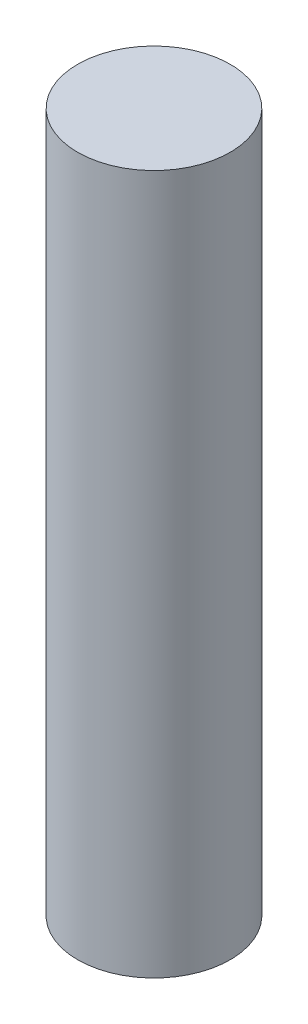
ISO-10303-21;
HEADER;
FILE_DESCRIPTION(('STEP AP214'),'2;1');
FILE_NAME('part.step','',(''),(''),'','','');
FILE_SCHEMA(('AUTOMOTIVE_DESIGN { 1 0 10303 214 1 1 1 1 }'));
ENDSEC;
DATA;
#1=APPLICATION_CONTEXT('core data for automotive mechanical design processes');
#2=APPLICATION_PROTOCOL_DEFINITION('international standard','automotive_design',2000,#1);
#3=PRODUCT_CONTEXT('',#1,'mechanical');
#4=PRODUCT('Part','Part','',(#3));
#5=PRODUCT_RELATED_PRODUCT_CATEGORY('part','',(#4));
#6=PRODUCT_DEFINITION_FORMATION('','',#4);
#7=PRODUCT_DEFINITION_CONTEXT('part definition',#1,'design');
#8=PRODUCT_DEFINITION('design','',#6,#7);
#9=PRODUCT_DEFINITION_SHAPE('','',#8);
#10=(LENGTH_UNIT() NAMED_UNIT(*) SI_UNIT(.MILLI.,.METRE.));
#11=(NAMED_UNIT(*) PLANE_ANGLE_UNIT() SI_UNIT($,.RADIAN.));
#12=(NAMED_UNIT(*) SI_UNIT($,.STERADIAN.) SOLID_ANGLE_UNIT());
#13=UNCERTAINTY_MEASURE_WITH_UNIT(LENGTH_MEASURE(1.E-05),#10,'distance_accuracy_value','');
#14=(GEOMETRIC_REPRESENTATION_CONTEXT(3) GLOBAL_UNCERTAINTY_ASSIGNED_CONTEXT((#13)) GLOBAL_UNIT_ASSIGNED_CONTEXT((#10,
#11,#12)) REPRESENTATION_CONTEXT('',''));
#15=CARTESIAN_POINT('',(0.,0.,0.));
#16=DIRECTION('',(0.,0.,1.));
#17=DIRECTION('',(1.,0.,0.));
#18=AXIS2_PLACEMENT_3D('',#15,#16,#17);
#19=CARTESIAN_POINT('',(0.,27.5,0.));
#20=DIRECTION('',(0.,-1.,0.));
#21=DIRECTION('',(0.,0.,-1.));
#22=AXIS2_PLACEMENT_3D('',#19,#20,#21);
#23=CYLINDRICAL_SURFACE('',#22,3.);
#24=CARTESIAN_POINT('',(0.,27.5,0.));
#25=DIRECTION('',(0.,1.,0.));
#26=DIRECTION('',(0.,0.,1.));
#27=AXIS2_PLACEMENT_3D('',#24,#25,#26);
#28=CIRCLE('',#27,3.);
#29=CARTESIAN_POINT('',(0.,27.5,3.));
#30=VERTEX_POINT('',#29);
#31=EDGE_CURVE('E10',#30,#30,#28,.T.);
#32=ORIENTED_EDGE('',*,*,#31,.F.);
#33=EDGE_LOOP('',(#32));
#34=FACE_BOUND('',#33,.T.);
#35=CARTESIAN_POINT('',(0.,0.,0.));
#36=DIRECTION('',(0.,1.,0.));
#37=DIRECTION('',(0.,0.,1.));
#38=AXIS2_PLACEMENT_3D('',#35,#36,#37);
#39=CIRCLE('',#38,3.);
#40=CARTESIAN_POINT('',(0.,0.,3.));
#41=VERTEX_POINT('',#40);
#42=EDGE_CURVE('E46',#41,#41,#39,.T.);
#43=ORIENTED_EDGE('',*,*,#42,.T.);
#44=EDGE_LOOP('',(#43));
#45=FACE_BOUND('',#44,.T.);
#46=ADVANCED_FACE('F43',(#34,#45),#23,.T.);
#47=CARTESIAN_POINT('',(0.,27.5,0.));
#48=DIRECTION('',(0.,1.,0.));
#49=DIRECTION('',(0.,0.,1.));
#50=AXIS2_PLACEMENT_3D('',#47,#48,#49);
#51=PLANE('',#50);
#52=ORIENTED_EDGE('',*,*,#31,.T.);
#53=EDGE_LOOP('',(#52));
#54=FACE_BOUND('',#53,.T.);
#55=ADVANCED_FACE('F60',(#54),#51,.T.);
#56=CARTESIAN_POINT('',(0.,0.,0.));
#57=DIRECTION('',(0.,1.,0.));
#58=DIRECTION('',(0.,0.,1.));
#59=AXIS2_PLACEMENT_3D('',#56,#57,#58);
#60=PLANE('',#59);
#61=ORIENTED_EDGE('',*,*,#42,.F.);
#62=EDGE_LOOP('',(#61));
#63=FACE_BOUND('',#62,.T.);
#64=ADVANCED_FACE('F58',(#63),#60,.F.);
#65=CLOSED_SHELL('',(#46,#55,#64));
#66=MANIFOLD_SOLID_BREP('B2',#65);
#67=ADVANCED_BREP_SHAPE_REPRESENTATION('',(#18,#66),#14);
#68=SHAPE_DEFINITION_REPRESENTATION(#9,#67);
ENDSEC;
END-ISO-10303-21;
